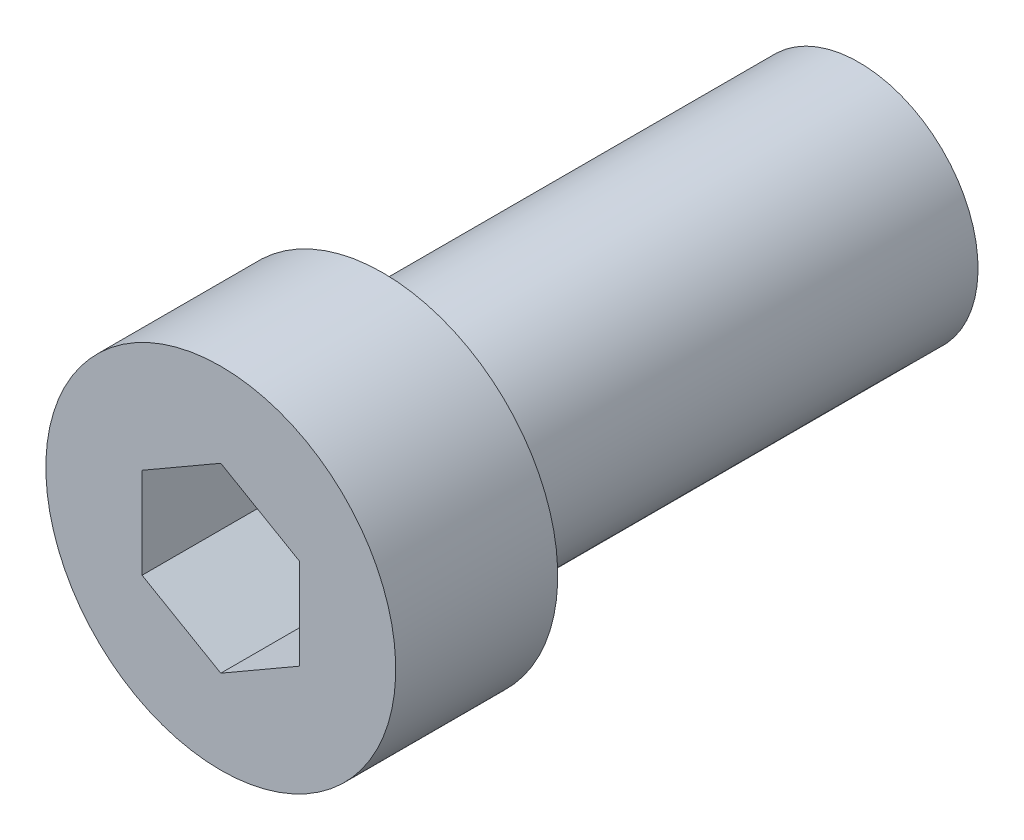
ISO-10303-21;
HEADER;
FILE_DESCRIPTION(('STEP AP214'),'2;1');
FILE_NAME('part.step','',(''),(''),'','','');
FILE_SCHEMA(('AUTOMOTIVE_DESIGN { 1 0 10303 214 1 1 1 1 }'));
ENDSEC;
DATA;
#1=APPLICATION_CONTEXT('core data for automotive mechanical design processes');
#2=APPLICATION_PROTOCOL_DEFINITION('international standard','automotive_design',2000,#1);
#3=PRODUCT_CONTEXT('',#1,'mechanical');
#4=PRODUCT('Part','Part','',(#3));
#5=PRODUCT_RELATED_PRODUCT_CATEGORY('part','',(#4));
#6=PRODUCT_DEFINITION_FORMATION('','',#4);
#7=PRODUCT_DEFINITION_CONTEXT('part definition',#1,'design');
#8=PRODUCT_DEFINITION('design','',#6,#7);
#9=PRODUCT_DEFINITION_SHAPE('','',#8);
#10=(LENGTH_UNIT() NAMED_UNIT(*) SI_UNIT(.MILLI.,.METRE.));
#11=(NAMED_UNIT(*) PLANE_ANGLE_UNIT() SI_UNIT($,.RADIAN.));
#12=(NAMED_UNIT(*) SI_UNIT($,.STERADIAN.) SOLID_ANGLE_UNIT());
#13=UNCERTAINTY_MEASURE_WITH_UNIT(LENGTH_MEASURE(1.E-05),#10,'distance_accuracy_value','');
#14=(GEOMETRIC_REPRESENTATION_CONTEXT(3) GLOBAL_UNCERTAINTY_ASSIGNED_CONTEXT((#13)) GLOBAL_UNIT_ASSIGNED_CONTEXT((#10,
#11,#12)) REPRESENTATION_CONTEXT('',''));
#15=CARTESIAN_POINT('',(0.,0.,0.));
#16=DIRECTION('',(0.,0.,1.));
#17=DIRECTION('',(1.,0.,0.));
#18=AXIS2_PLACEMENT_3D('',#15,#16,#17);
#19=CARTESIAN_POINT('',(0.,0.,0.25268178913738));
#20=DIRECTION('',(0.,0.,1.));
#21=DIRECTION('',(1.,0.,0.));
#22=AXIS2_PLACEMENT_3D('',#19,#20,#21);
#23=PLANE('',#22);
#24=DIRECTION('',(-0.866025403784439,-0.5,0.));
#25=VECTOR('',#24,1.);
#26=CARTESIAN_POINT('',(0.,-1.90873944092681,0.252681789137378));
#27=LINE('',#26,#25);
#28=CARTESIAN_POINT('',(1.65301684504793,-0.954369720463404,0.252681789137379));
#29=VERTEX_POINT('',#28);
#30=CARTESIAN_POINT('',(0.,-1.90873944092681,0.252681789137378));
#31=VERTEX_POINT('',#30);
#32=EDGE_CURVE('E68',#29,#31,#27,.T.);
#33=ORIENTED_EDGE('',*,*,#32,.F.);
#34=DIRECTION('',(0.,1.,0.));
#35=VECTOR('',#34,1.);
#36=CARTESIAN_POINT('',(1.65301684504793,-0.954369720463404,0.25268178913738));
#37=LINE('',#36,#35);
#38=CARTESIAN_POINT('',(1.65301684504793,0.954369720463404,0.252681789137379));
#39=VERTEX_POINT('',#38);
#40=EDGE_CURVE('E70',#39,#29,#37,.F.);
#41=ORIENTED_EDGE('',*,*,#40,.F.);
#42=DIRECTION('',(0.866025403784439,-0.5,0.));
#43=VECTOR('',#42,1.);
#44=CARTESIAN_POINT('',(1.65301684504793,0.954369720463404,0.252681789137378));
#45=LINE('',#44,#43);
#46=CARTESIAN_POINT('',(0.,1.90873944092681,0.252681789137378));
#47=VERTEX_POINT('',#46);
#48=EDGE_CURVE('E72',#47,#39,#45,.T.);
#49=ORIENTED_EDGE('',*,*,#48,.F.);
#50=DIRECTION('',(0.866025403784439,0.5,0.));
#51=VECTOR('',#50,1.);
#52=CARTESIAN_POINT('',(0.,1.90873944092681,0.252681789137378));
#53=LINE('',#52,#51);
#54=CARTESIAN_POINT('',(-1.65301684504793,0.954369720463403,0.252681789137379));
#55=VERTEX_POINT('',#54);
#56=EDGE_CURVE('E122',#55,#47,#53,.T.);
#57=ORIENTED_EDGE('',*,*,#56,.F.);
#58=DIRECTION('',(0.,1.,0.));
#59=VECTOR('',#58,1.);
#60=CARTESIAN_POINT('',(-1.65301684504793,0.954369720463404,0.25268178913738));
#61=LINE('',#60,#59);
#62=CARTESIAN_POINT('',(-1.65301684504793,-0.954369720463404,0.252681789137379));
#63=VERTEX_POINT('',#62);
#64=EDGE_CURVE('E127',#63,#55,#61,.T.);
#65=ORIENTED_EDGE('',*,*,#64,.F.);
#66=DIRECTION('',(-0.866025403784439,0.5,0.));
#67=VECTOR('',#66,1.);
#68=CARTESIAN_POINT('',(-1.65301684504793,-0.954369720463404,0.252681789137378));
#69=LINE('',#68,#67);
#70=EDGE_CURVE('E132',#31,#63,#69,.T.);
#71=ORIENTED_EDGE('',*,*,#70,.F.);
#72=EDGE_LOOP('',(#33,#41,#49,#57,#65,#71));
#73=FACE_BOUND('',#72,.T.);
#74=ADVANCED_FACE('F17',(#73),#23,.T.);
#75=CARTESIAN_POINT('',(1.65301684504793,0.954369720463404,3.40163897763578));
#76=DIRECTION('',(-0.5,-0.866025403784439,0.));
#77=DIRECTION('',(0.866025403784439,-0.5,0.));
#78=AXIS2_PLACEMENT_3D('',#75,#76,#77);
#79=PLANE('',#78);
#80=DIRECTION('',(0.866025403784439,-0.5,0.));
#81=VECTOR('',#80,1.);
#82=CARTESIAN_POINT('',(0.,1.90873944092681,3.40163897763578));
#83=LINE('',#82,#81);
#84=CARTESIAN_POINT('',(0.,1.90873944092681,3.40163897763578));
#85=VERTEX_POINT('',#84);
#86=CARTESIAN_POINT('',(1.65301684504793,0.954369720463404,3.40163897763578));
#87=VERTEX_POINT('',#86);
#88=EDGE_CURVE('E118',#85,#87,#83,.T.);
#89=ORIENTED_EDGE('',*,*,#88,.F.);
#90=DIRECTION('',(0.,0.,1.));
#91=VECTOR('',#90,1.);
#92=CARTESIAN_POINT('',(0.,1.90873944092681,3.40163897763578));
#93=LINE('',#92,#91);
#94=EDGE_CURVE('E83',#47,#85,#93,.T.);
#95=ORIENTED_EDGE('',*,*,#94,.F.);
#96=ORIENTED_EDGE('',*,*,#48,.T.);
#97=DIRECTION('',(0.,0.,1.));
#98=VECTOR('',#97,1.);
#99=CARTESIAN_POINT('',(1.65301684504793,0.954369720463404,3.40163897763578));
#100=LINE('',#99,#98);
#101=EDGE_CURVE('E77',#87,#39,#100,.F.);
#102=ORIENTED_EDGE('',*,*,#101,.F.);
#103=EDGE_LOOP('',(#89,#95,#96,#102));
#104=FACE_BOUND('',#103,.T.);
#105=ADVANCED_FACE('F80',(#104),#79,.T.);
#106=CARTESIAN_POINT('',(1.65301684504793,-0.954369720463404,3.40163897763578));
#107=DIRECTION('',(-1.,0.,0.));
#108=DIRECTION('',(0.,0.,1.));
#109=AXIS2_PLACEMENT_3D('',#106,#107,#108);
#110=PLANE('',#109);
#111=DIRECTION('',(0.,-1.,0.));
#112=VECTOR('',#111,1.);
#113=CARTESIAN_POINT('',(1.65301684504793,0.,3.40163897763578));
#114=LINE('',#113,#112);
#115=CARTESIAN_POINT('',(1.65301684504793,-0.954369720463404,3.40163897763578));
#116=VERTEX_POINT('',#115);
#117=EDGE_CURVE('E88',#87,#116,#114,.T.);
#118=ORIENTED_EDGE('',*,*,#117,.F.);
#119=ORIENTED_EDGE('',*,*,#101,.T.);
#120=ORIENTED_EDGE('',*,*,#40,.T.);
#121=DIRECTION('',(0.,0.,1.));
#122=VECTOR('',#121,1.);
#123=CARTESIAN_POINT('',(1.65301684504793,-0.954369720463402,3.40163897763578));
#124=LINE('',#123,#122);
#125=EDGE_CURVE('E91',#116,#29,#124,.F.);
#126=ORIENTED_EDGE('',*,*,#125,.F.);
#127=EDGE_LOOP('',(#118,#119,#120,#126));
#128=FACE_BOUND('',#127,.T.);
#129=ADVANCED_FACE('F86',(#128),#110,.T.);
#130=CARTESIAN_POINT('',(0.,-1.90873944092681,3.40163897763578));
#131=DIRECTION('',(-0.5,0.866025403784439,0.));
#132=DIRECTION('',(-0.866025403784439,-0.5,0.));
#133=AXIS2_PLACEMENT_3D('',#130,#131,#132);
#134=PLANE('',#133);
#135=DIRECTION('',(-0.866025403784439,-0.5,0.));
#136=VECTOR('',#135,1.);
#137=CARTESIAN_POINT('',(1.65301684504793,-0.954369720463404,3.40163897763578));
#138=LINE('',#137,#136);
#139=CARTESIAN_POINT('',(0.,-1.90873944092681,3.40163897763578));
#140=VERTEX_POINT('',#139);
#141=EDGE_CURVE('E114',#116,#140,#138,.T.);
#142=ORIENTED_EDGE('',*,*,#141,.F.);
#143=ORIENTED_EDGE('',*,*,#125,.T.);
#144=ORIENTED_EDGE('',*,*,#32,.T.);
#145=DIRECTION('',(0.,0.,1.));
#146=VECTOR('',#145,1.);
#147=CARTESIAN_POINT('',(0.,-1.90873944092681,3.40163897763578));
#148=LINE('',#147,#146);
#149=EDGE_CURVE('E129',#140,#31,#148,.F.);
#150=ORIENTED_EDGE('',*,*,#149,.F.);
#151=EDGE_LOOP('',(#142,#143,#144,#150));
#152=FACE_BOUND('',#151,.T.);
#153=ADVANCED_FACE('F136',(#152),#134,.T.);
#154=CARTESIAN_POINT('',(-1.65301684504793,-0.954369720463404,3.40163897763578));
#155=DIRECTION('',(0.5,0.866025403784439,0.));
#156=DIRECTION('',(-0.866025403784439,0.5,0.));
#157=AXIS2_PLACEMENT_3D('',#154,#155,#156);
#158=PLANE('',#157);
#159=DIRECTION('',(-0.866025403784439,0.5,0.));
#160=VECTOR('',#159,1.);
#161=CARTESIAN_POINT('',(0.,-1.90873944092681,3.40163897763578));
#162=LINE('',#161,#160);
#163=CARTESIAN_POINT('',(-1.65301684504793,-0.954369720463404,3.40163897763578));
#164=VERTEX_POINT('',#163);
#165=EDGE_CURVE('E109',#140,#164,#162,.T.);
#166=ORIENTED_EDGE('',*,*,#165,.F.);
#167=ORIENTED_EDGE('',*,*,#149,.T.);
#168=ORIENTED_EDGE('',*,*,#70,.T.);
#169=DIRECTION('',(0.,0.,-1.));
#170=VECTOR('',#169,1.);
#171=CARTESIAN_POINT('',(-1.65301684504793,-0.954369720463404,3.40163897763578));
#172=LINE('',#171,#170);
#173=EDGE_CURVE('E124',#164,#63,#172,.T.);
#174=ORIENTED_EDGE('',*,*,#173,.F.);
#175=EDGE_LOOP('',(#166,#167,#168,#174));
#176=FACE_BOUND('',#175,.T.);
#177=ADVANCED_FACE('F143',(#176),#158,.T.);
#178=CARTESIAN_POINT('',(-1.65301684504793,0.954369720463404,3.40163897763578));
#179=DIRECTION('',(1.,0.,0.));
#180=DIRECTION('',(0.,0.,-1.));
#181=AXIS2_PLACEMENT_3D('',#178,#179,#180);
#182=PLANE('',#181);
#183=DIRECTION('',(0.,-1.,0.));
#184=VECTOR('',#183,1.);
#185=CARTESIAN_POINT('',(-1.65301684504793,0.,3.40163897763578));
#186=LINE('',#185,#184);
#187=CARTESIAN_POINT('',(-1.65301684504793,0.954369720463403,3.40163897763578));
#188=VERTEX_POINT('',#187);
#189=EDGE_CURVE('E105',#164,#188,#186,.F.);
#190=ORIENTED_EDGE('',*,*,#189,.F.);
#191=ORIENTED_EDGE('',*,*,#173,.T.);
#192=ORIENTED_EDGE('',*,*,#64,.T.);
#193=DIRECTION('',(0.,0.,1.));
#194=VECTOR('',#193,1.);
#195=CARTESIAN_POINT('',(-1.65301684504793,0.954369720463402,3.40163897763578));
#196=LINE('',#195,#194);
#197=EDGE_CURVE('E35',#188,#55,#196,.F.);
#198=ORIENTED_EDGE('',*,*,#197,.F.);
#199=EDGE_LOOP('',(#190,#191,#192,#198));
#200=FACE_BOUND('',#199,.T.);
#201=ADVANCED_FACE('F141',(#200),#182,.T.);
#202=CARTESIAN_POINT('',(0.,1.90873944092681,3.40163897763578));
#203=DIRECTION('',(0.5,-0.866025403784439,0.));
#204=DIRECTION('',(0.866025403784439,0.5,0.));
#205=AXIS2_PLACEMENT_3D('',#202,#203,#204);
#206=PLANE('',#205);
#207=DIRECTION('',(0.866025403784439,0.5,0.));
#208=VECTOR('',#207,1.);
#209=CARTESIAN_POINT('',(-1.65301684504793,0.954369720463403,3.40163897763578));
#210=LINE('',#209,#208);
#211=EDGE_CURVE('E101',#188,#85,#210,.T.);
#212=ORIENTED_EDGE('',*,*,#211,.F.);
#213=ORIENTED_EDGE('',*,*,#197,.T.);
#214=ORIENTED_EDGE('',*,*,#56,.T.);
#215=ORIENTED_EDGE('',*,*,#94,.T.);
#216=EDGE_LOOP('',(#212,#213,#214,#215));
#217=FACE_BOUND('',#216,.T.);
#218=ADVANCED_FACE('F140',(#217),#206,.T.);
#219=CARTESIAN_POINT('',(3.67337076677332,0.,3.40163897763578));
#220=DIRECTION('',(0.,0.,1.));
#221=DIRECTION('',(0.,-1.,0.));
#222=AXIS2_PLACEMENT_3D('',#219,#220,#221);
#223=PLANE('',#222);
#224=CARTESIAN_POINT('',(0.,0.,3.40163897763578));
#225=DIRECTION('',(0.,0.,-1.));
#226=DIRECTION('',(0.,1.,0.));
#227=AXIS2_PLACEMENT_3D('',#224,#225,#226);
#228=CIRCLE('',#227,3.67337076677332);
#229=CARTESIAN_POINT('',(0.,3.67337076677332,3.40163897763578));
#230=VERTEX_POINT('',#229);
#231=EDGE_CURVE('E20',#230,#230,#228,.T.);
#232=ORIENTED_EDGE('',*,*,#231,.F.);
#233=EDGE_LOOP('',(#232));
#234=FACE_BOUND('',#233,.T.);
#235=ORIENTED_EDGE('',*,*,#189,.T.);
#236=ORIENTED_EDGE('',*,*,#211,.T.);
#237=ORIENTED_EDGE('',*,*,#88,.T.);
#238=ORIENTED_EDGE('',*,*,#117,.T.);
#239=ORIENTED_EDGE('',*,*,#141,.T.);
#240=ORIENTED_EDGE('',*,*,#165,.T.);
#241=EDGE_LOOP('',(#235,#236,#237,#238,#239,#240));
#242=FACE_BOUND('',#241,.T.);
#243=ADVANCED_FACE('F138',(#234,#242),#223,.T.);
#244=CARTESIAN_POINT('',(0.,0.,0.));
#245=DIRECTION('',(0.,0.,-1.));
#246=DIRECTION('',(0.,1.,0.));
#247=AXIS2_PLACEMENT_3D('',#244,#245,#246);
#248=CYLINDRICAL_SURFACE('',#247,3.67337076677332);
#249=CARTESIAN_POINT('',(0.,0.,0.));
#250=DIRECTION('',(0.,0.,-1.));
#251=DIRECTION('',(0.,1.,0.));
#252=AXIS2_PLACEMENT_3D('',#249,#250,#251);
#253=CIRCLE('',#252,3.67337076677332);
#254=CARTESIAN_POINT('',(0.,3.67337076677332,0.));
#255=VERTEX_POINT('',#254);
#256=EDGE_CURVE('E96',#255,#255,#253,.T.);
#257=ORIENTED_EDGE('',*,*,#256,.F.);
#258=EDGE_LOOP('',(#257));
#259=FACE_BOUND('',#258,.T.);
#260=ORIENTED_EDGE('',*,*,#231,.T.);
#261=EDGE_LOOP('',(#260));
#262=FACE_BOUND('',#261,.T.);
#263=ADVANCED_FACE('F170',(#259,#262),#248,.T.);
#264=CARTESIAN_POINT('',(0.,0.,0.));
#265=DIRECTION('',(0.,0.,-1.));
#266=DIRECTION('',(0.,1.,0.));
#267=AXIS2_PLACEMENT_3D('',#264,#265,#266);
#268=PLANE('',#267);
#269=ORIENTED_EDGE('',*,*,#256,.T.);
#270=EDGE_LOOP('',(#269));
#271=FACE_BOUND('',#270,.T.);
#272=CARTESIAN_POINT('',(0.,0.,0.));
#273=DIRECTION('',(0.,0.,1.));
#274=DIRECTION('',(0.,-1.,0.));
#275=AXIS2_PLACEMENT_3D('',#272,#273,#274);
#276=CIRCLE('',#275,2.49999999999685);
#277=CARTESIAN_POINT('',(0.,-2.49999999999685,0.));
#278=VERTEX_POINT('',#277);
#279=EDGE_CURVE('E26',#278,#278,#276,.F.);
#280=ORIENTED_EDGE('',*,*,#279,.F.);
#281=EDGE_LOOP('',(#280));
#282=FACE_BOUND('',#281,.T.);
#283=ADVANCED_FACE('F163',(#271,#282),#268,.T.);
#284=CARTESIAN_POINT('',(0.,0.,-10.));
#285=DIRECTION('',(0.,0.,-1.));
#286=DIRECTION('',(0.,1.,0.));
#287=AXIS2_PLACEMENT_3D('',#284,#285,#286);
#288=PLANE('',#287);
#289=CARTESIAN_POINT('',(0.,0.,-9.99999999999091));
#290=DIRECTION('',(0.,0.,1.));
#291=DIRECTION('',(0.,-1.,0.));
#292=AXIS2_PLACEMENT_3D('',#289,#290,#291);
#293=CIRCLE('',#292,2.49875);
#294=CARTESIAN_POINT('',(0.,-2.49875,-9.99999999999091));
#295=VERTEX_POINT('',#294);
#296=EDGE_CURVE('E11',#295,#295,#293,.T.);
#297=ORIENTED_EDGE('',*,*,#296,.F.);
#298=EDGE_LOOP('',(#297));
#299=FACE_BOUND('',#298,.T.);
#300=ADVANCED_FACE('F156',(#299),#288,.T.);
#301=CARTESIAN_POINT('',(0.,0.,-1.13686990802466E-10));
#302=DIRECTION('',(0.,0.,1.));
#303=DIRECTION('',(0.,-1.,0.));
#304=AXIS2_PLACEMENT_3D('',#301,#302,#303);
#305=CONICAL_SURFACE('',#304,2.49999999999684,0.000124999999035646);
#306=ORIENTED_EDGE('',*,*,#296,.T.);
#307=EDGE_LOOP('',(#306));
#308=FACE_BOUND('',#307,.T.);
#309=ORIENTED_EDGE('',*,*,#279,.T.);
#310=EDGE_LOOP('',(#309));
#311=FACE_BOUND('',#310,.T.);
#312=ADVANCED_FACE('F154',(#308,#311),#305,.T.);
#313=CLOSED_SHELL('',(#74,#105,#129,#153,#177,#201,#218,#243,#263,#283,#300,#312));
#314=MANIFOLD_SOLID_BREP('B1',#313);
#315=ADVANCED_BREP_SHAPE_REPRESENTATION('',(#18,#314),#14);
#316=SHAPE_DEFINITION_REPRESENTATION(#9,#315);
ENDSEC;
END-ISO-10303-21;
